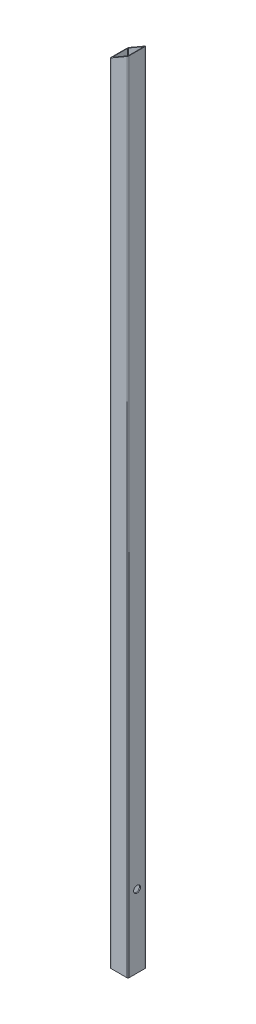
ISO-10303-21;
HEADER;
FILE_DESCRIPTION(('STEP AP214'),'2;1');
FILE_NAME('part.step','',(''),(''),'','','');
FILE_SCHEMA(('AUTOMOTIVE_DESIGN { 1 0 10303 214 1 1 1 1 }'));
ENDSEC;
DATA;
#1=APPLICATION_CONTEXT('core data for automotive mechanical design processes');
#2=APPLICATION_PROTOCOL_DEFINITION('international standard','automotive_design',2000,#1);
#3=PRODUCT_CONTEXT('',#1,'mechanical');
#4=PRODUCT('Part','Part','',(#3));
#5=PRODUCT_RELATED_PRODUCT_CATEGORY('part','',(#4));
#6=PRODUCT_DEFINITION_FORMATION('','',#4);
#7=PRODUCT_DEFINITION_CONTEXT('part definition',#1,'design');
#8=PRODUCT_DEFINITION('design','',#6,#7);
#9=PRODUCT_DEFINITION_SHAPE('','',#8);
#10=(LENGTH_UNIT() NAMED_UNIT(*) SI_UNIT(.MILLI.,.METRE.));
#11=(NAMED_UNIT(*) PLANE_ANGLE_UNIT() SI_UNIT($,.RADIAN.));
#12=(NAMED_UNIT(*) SI_UNIT($,.STERADIAN.) SOLID_ANGLE_UNIT());
#13=UNCERTAINTY_MEASURE_WITH_UNIT(LENGTH_MEASURE(1.E-05),#10,'distance_accuracy_value','');
#14=(GEOMETRIC_REPRESENTATION_CONTEXT(3) GLOBAL_UNCERTAINTY_ASSIGNED_CONTEXT((#13)) GLOBAL_UNIT_ASSIGNED_CONTEXT((#10,
#11,#12)) REPRESENTATION_CONTEXT('',''));
#15=CARTESIAN_POINT('',(0.,0.,0.));
#16=DIRECTION('',(0.,0.,1.));
#17=DIRECTION('',(1.,0.,0.));
#18=AXIS2_PLACEMENT_3D('',#15,#16,#17);
#19=CARTESIAN_POINT('',(-22.,-150.,22.));
#20=DIRECTION('',(0.,1.,0.));
#21=DIRECTION('',(0.,0.,1.));
#22=AXIS2_PLACEMENT_3D('',#19,#20,#21);
#23=CYLINDRICAL_SURFACE('',#22,3.);
#24=DIRECTION('',(0.,1.,0.));
#25=VECTOR('',#24,1.);
#26=CARTESIAN_POINT('',(-22.,-150.,25.));
#27=LINE('',#26,#25);
#28=CARTESIAN_POINT('',(-22.,-150.,25.));
#29=VERTEX_POINT('',#28);
#30=CARTESIAN_POINT('',(-22.,2019.97778600214,25.));
#31=VERTEX_POINT('',#30);
#32=EDGE_CURVE('E159',#29,#31,#27,.T.);
#33=ORIENTED_EDGE('',*,*,#32,.T.);
#34=CARTESIAN_POINT('',(-22.,2019.97778600214,22.));
#35=DIRECTION('',(0.5,-0.866025403784439,0.));
#36=DIRECTION('',(-0.866025403784439,-0.5,0.));
#37=AXIS2_PLACEMENT_3D('',#34,#35,#36);
#38=ELLIPSE('',#37,3.46410161513776,3.);
#39=CARTESIAN_POINT('',(-25.,2018.24573519457,22.));
#40=VERTEX_POINT('',#39);
#41=EDGE_CURVE('E169',#31,#40,#38,.T.);
#42=ORIENTED_EDGE('',*,*,#41,.T.);
#43=DIRECTION('',(0.,1.,0.));
#44=VECTOR('',#43,1.);
#45=CARTESIAN_POINT('',(-25.,-150.,22.));
#46=LINE('',#45,#44);
#47=CARTESIAN_POINT('',(-25.,-150.,22.));
#48=VERTEX_POINT('',#47);
#49=EDGE_CURVE('E11',#48,#40,#46,.T.);
#50=ORIENTED_EDGE('',*,*,#49,.F.);
#51=CARTESIAN_POINT('',(-22.,-150.,22.));
#52=DIRECTION('',(0.,1.,0.));
#53=DIRECTION('',(0.,0.,1.));
#54=AXIS2_PLACEMENT_3D('',#51,#52,#53);
#55=CIRCLE('',#54,3.);
#56=EDGE_CURVE('E236',#48,#29,#55,.T.);
#57=ORIENTED_EDGE('',*,*,#56,.T.);
#58=EDGE_LOOP('',(#33,#42,#50,#57));
#59=FACE_BOUND('',#58,.T.);
#60=ADVANCED_FACE('F35',(#59),#23,.T.);
#61=CARTESIAN_POINT('',(-25.,-150.,-22.));
#62=DIRECTION('',(-1.,0.,0.));
#63=DIRECTION('',(0.,0.,1.));
#64=AXIS2_PLACEMENT_3D('',#61,#62,#63);
#65=PLANE('',#64);
#66=CARTESIAN_POINT('',(-25.,50.,-2.1163626406917E-13));
#67=DIRECTION('',(-1.,0.,0.));
#68=DIRECTION('',(0.,0.,1.));
#69=AXIS2_PLACEMENT_3D('',#66,#67,#68);
#70=CIRCLE('',#69,9.5);
#71=CARTESIAN_POINT('',(-25.,50.,9.49999999999979));
#72=VERTEX_POINT('',#71);
#73=EDGE_CURVE('E367',#72,#72,#70,.T.);
#74=ORIENTED_EDGE('',*,*,#73,.F.);
#75=EDGE_LOOP('',(#74));
#76=FACE_BOUND('',#75,.T.);
#77=ORIENTED_EDGE('',*,*,#49,.T.);
#78=DIRECTION('',(0.,0.,-1.));
#79=VECTOR('',#78,1.);
#80=CARTESIAN_POINT('',(-25.,2018.24573519457,-22.));
#81=LINE('',#80,#79);
#82=CARTESIAN_POINT('',(-25.,2018.24573519457,-22.));
#83=VERTEX_POINT('',#82);
#84=EDGE_CURVE('E186',#40,#83,#81,.T.);
#85=ORIENTED_EDGE('',*,*,#84,.T.);
#86=DIRECTION('',(0.,1.,0.));
#87=VECTOR('',#86,1.);
#88=CARTESIAN_POINT('',(-25.,-150.,-22.));
#89=LINE('',#88,#87);
#90=CARTESIAN_POINT('',(-25.,-150.,-22.));
#91=VERTEX_POINT('',#90);
#92=EDGE_CURVE('E43',#91,#83,#89,.T.);
#93=ORIENTED_EDGE('',*,*,#92,.F.);
#94=DIRECTION('',(0.,0.,1.));
#95=VECTOR('',#94,1.);
#96=CARTESIAN_POINT('',(-25.,-150.,-22.));
#97=LINE('',#96,#95);
#98=EDGE_CURVE('E266',#91,#48,#97,.T.);
#99=ORIENTED_EDGE('',*,*,#98,.T.);
#100=EDGE_LOOP('',(#77,#85,#93,#99));
#101=FACE_BOUND('',#100,.T.);
#102=ADVANCED_FACE('F295',(#76,#101),#65,.T.);
#103=CARTESIAN_POINT('',(-22.,-150.,-22.));
#104=DIRECTION('',(0.,1.,0.));
#105=DIRECTION('',(0.,0.,1.));
#106=AXIS2_PLACEMENT_3D('',#103,#104,#105);
#107=CYLINDRICAL_SURFACE('',#106,3.);
#108=ORIENTED_EDGE('',*,*,#92,.T.);
#109=CARTESIAN_POINT('',(-22.,2019.97778600214,-22.));
#110=DIRECTION('',(0.5,-0.866025403784439,0.));
#111=DIRECTION('',(-0.866025403784439,-0.5,0.));
#112=AXIS2_PLACEMENT_3D('',#109,#110,#111);
#113=ELLIPSE('',#112,3.46410161513776,3.);
#114=CARTESIAN_POINT('',(-22.,2019.97778600214,-25.));
#115=VERTEX_POINT('',#114);
#116=EDGE_CURVE('E183',#83,#115,#113,.T.);
#117=ORIENTED_EDGE('',*,*,#116,.T.);
#118=DIRECTION('',(0.,1.,0.));
#119=VECTOR('',#118,1.);
#120=CARTESIAN_POINT('',(-22.,-150.,-25.));
#121=LINE('',#120,#119);
#122=CARTESIAN_POINT('',(-22.,-150.,-25.));
#123=VERTEX_POINT('',#122);
#124=EDGE_CURVE('E270',#123,#115,#121,.T.);
#125=ORIENTED_EDGE('',*,*,#124,.F.);
#126=CARTESIAN_POINT('',(-22.,-150.,-22.));
#127=DIRECTION('',(0.,1.,0.));
#128=DIRECTION('',(0.,0.,1.));
#129=AXIS2_PLACEMENT_3D('',#126,#127,#128);
#130=CIRCLE('',#129,3.);
#131=EDGE_CURVE('E263',#123,#91,#130,.T.);
#132=ORIENTED_EDGE('',*,*,#131,.T.);
#133=EDGE_LOOP('',(#108,#117,#125,#132));
#134=FACE_BOUND('',#133,.T.);
#135=ADVANCED_FACE('F292',(#134),#107,.T.);
#136=CARTESIAN_POINT('',(-22.,-150.,-25.));
#137=DIRECTION('',(0.,0.,-1.));
#138=DIRECTION('',(-1.,0.,0.));
#139=AXIS2_PLACEMENT_3D('',#136,#137,#138);
#140=PLANE('',#139);
#141=ORIENTED_EDGE('',*,*,#124,.T.);
#142=DIRECTION('',(0.866025403784439,0.5,0.));
#143=VECTOR('',#142,1.);
#144=CARTESIAN_POINT('',(16.4869804220584,2042.19825450911,-25.));
#145=LINE('',#144,#143);
#146=CARTESIAN_POINT('',(22.,2045.38119784648,-25.));
#147=VERTEX_POINT('',#146);
#148=EDGE_CURVE('E180',#115,#147,#145,.T.);
#149=ORIENTED_EDGE('',*,*,#148,.T.);
#150=DIRECTION('',(0.,1.,0.));
#151=VECTOR('',#150,1.);
#152=CARTESIAN_POINT('',(22.,-150.,-25.));
#153=LINE('',#152,#151);
#154=CARTESIAN_POINT('',(22.,-150.,-25.));
#155=VERTEX_POINT('',#154);
#156=EDGE_CURVE('E272',#155,#147,#153,.T.);
#157=ORIENTED_EDGE('',*,*,#156,.F.);
#158=DIRECTION('',(-1.,0.,0.));
#159=VECTOR('',#158,1.);
#160=CARTESIAN_POINT('',(-22.,-150.,-25.));
#161=LINE('',#160,#159);
#162=EDGE_CURVE('E260',#155,#123,#161,.T.);
#163=ORIENTED_EDGE('',*,*,#162,.T.);
#164=EDGE_LOOP('',(#141,#149,#157,#163));
#165=FACE_BOUND('',#164,.T.);
#166=ADVANCED_FACE('F289',(#165),#140,.T.);
#167=CARTESIAN_POINT('',(22.,-150.,-22.));
#168=DIRECTION('',(0.,1.,0.));
#169=DIRECTION('',(0.,0.,1.));
#170=AXIS2_PLACEMENT_3D('',#167,#168,#169);
#171=CYLINDRICAL_SURFACE('',#170,3.00000000000001);
#172=ORIENTED_EDGE('',*,*,#156,.T.);
#173=CARTESIAN_POINT('',(22.,2045.38119784648,-22.));
#174=DIRECTION('',(0.5,-0.866025403784439,0.));
#175=DIRECTION('',(-0.866025403784439,-0.5,0.));
#176=AXIS2_PLACEMENT_3D('',#173,#174,#175);
#177=ELLIPSE('',#176,3.46410161513776,3.00000000000001);
#178=CARTESIAN_POINT('',(25.,2047.11324865405,-22.));
#179=VERTEX_POINT('',#178);
#180=EDGE_CURVE('E174',#147,#179,#177,.T.);
#181=ORIENTED_EDGE('',*,*,#180,.T.);
#182=DIRECTION('',(0.,1.,0.));
#183=VECTOR('',#182,1.);
#184=CARTESIAN_POINT('',(25.,-150.,-22.));
#185=LINE('',#184,#183);
#186=CARTESIAN_POINT('',(25.,-150.,-22.));
#187=VERTEX_POINT('',#186);
#188=EDGE_CURVE('E274',#187,#179,#185,.T.);
#189=ORIENTED_EDGE('',*,*,#188,.F.);
#190=CARTESIAN_POINT('',(22.,-150.,-22.));
#191=DIRECTION('',(0.,1.,0.));
#192=DIRECTION('',(0.,0.,-1.));
#193=AXIS2_PLACEMENT_3D('',#190,#191,#192);
#194=CIRCLE('',#193,3.00000000000001);
#195=EDGE_CURVE('E257',#187,#155,#194,.T.);
#196=ORIENTED_EDGE('',*,*,#195,.T.);
#197=EDGE_LOOP('',(#172,#181,#189,#196));
#198=FACE_BOUND('',#197,.T.);
#199=ADVANCED_FACE('F287',(#198),#171,.T.);
#200=CARTESIAN_POINT('',(25.,-150.,-22.));
#201=DIRECTION('',(1.,0.,0.));
#202=DIRECTION('',(0.,0.,-1.));
#203=AXIS2_PLACEMENT_3D('',#200,#201,#202);
#204=PLANE('',#203);
#205=CARTESIAN_POINT('',(25.,50.,-2.1163626406917E-13));
#206=DIRECTION('',(-1.,0.,0.));
#207=DIRECTION('',(0.,0.,1.));
#208=AXIS2_PLACEMENT_3D('',#205,#206,#207);
#209=CIRCLE('',#208,9.5);
#210=CARTESIAN_POINT('',(25.,50.,9.49999999999979));
#211=VERTEX_POINT('',#210);
#212=EDGE_CURVE('E363',#211,#211,#209,.T.);
#213=ORIENTED_EDGE('',*,*,#212,.T.);
#214=EDGE_LOOP('',(#213));
#215=FACE_BOUND('',#214,.T.);
#216=ORIENTED_EDGE('',*,*,#188,.T.);
#217=DIRECTION('',(0.,0.,1.));
#218=VECTOR('',#217,1.);
#219=CARTESIAN_POINT('',(25.,2047.11324865405,-22.));
#220=LINE('',#219,#218);
#221=CARTESIAN_POINT('',(25.,2047.11324865405,22.));
#222=VERTEX_POINT('',#221);
#223=EDGE_CURVE('E172',#179,#222,#220,.T.);
#224=ORIENTED_EDGE('',*,*,#223,.T.);
#225=DIRECTION('',(0.,1.,0.));
#226=VECTOR('',#225,1.);
#227=CARTESIAN_POINT('',(25.,-150.,22.));
#228=LINE('',#227,#226);
#229=CARTESIAN_POINT('',(25.,-150.,22.));
#230=VERTEX_POINT('',#229);
#231=EDGE_CURVE('E158',#230,#222,#228,.T.);
#232=ORIENTED_EDGE('',*,*,#231,.F.);
#233=DIRECTION('',(0.,0.,-1.));
#234=VECTOR('',#233,1.);
#235=CARTESIAN_POINT('',(25.,-150.,-22.));
#236=LINE('',#235,#234);
#237=EDGE_CURVE('E254',#230,#187,#236,.T.);
#238=ORIENTED_EDGE('',*,*,#237,.T.);
#239=EDGE_LOOP('',(#216,#224,#232,#238));
#240=FACE_BOUND('',#239,.T.);
#241=ADVANCED_FACE('F283',(#215,#240),#204,.T.);
#242=CARTESIAN_POINT('',(22.,-150.,22.));
#243=DIRECTION('',(0.,1.,0.));
#244=DIRECTION('',(0.,0.,1.));
#245=AXIS2_PLACEMENT_3D('',#242,#243,#244);
#246=CYLINDRICAL_SURFACE('',#245,3.);
#247=ORIENTED_EDGE('',*,*,#231,.T.);
#248=CARTESIAN_POINT('',(22.,2045.38119784648,22.));
#249=DIRECTION('',(0.5,-0.866025403784439,0.));
#250=DIRECTION('',(-0.866025403784439,-0.5,0.));
#251=AXIS2_PLACEMENT_3D('',#248,#249,#250);
#252=ELLIPSE('',#251,3.46410161513775,3.);
#253=CARTESIAN_POINT('',(22.,2045.38119784648,25.));
#254=VERTEX_POINT('',#253);
#255=EDGE_CURVE('E166',#222,#254,#252,.T.);
#256=ORIENTED_EDGE('',*,*,#255,.T.);
#257=DIRECTION('',(0.,1.,0.));
#258=VECTOR('',#257,1.);
#259=CARTESIAN_POINT('',(22.,-150.,25.));
#260=LINE('',#259,#258);
#261=CARTESIAN_POINT('',(22.,-150.,25.));
#262=VERTEX_POINT('',#261);
#263=EDGE_CURVE('E148',#262,#254,#260,.T.);
#264=ORIENTED_EDGE('',*,*,#263,.F.);
#265=CARTESIAN_POINT('',(22.,-150.,22.));
#266=DIRECTION('',(0.,1.,0.));
#267=DIRECTION('',(0.,0.,1.));
#268=AXIS2_PLACEMENT_3D('',#265,#266,#267);
#269=CIRCLE('',#268,3.);
#270=EDGE_CURVE('E252',#262,#230,#269,.T.);
#271=ORIENTED_EDGE('',*,*,#270,.T.);
#272=EDGE_LOOP('',(#247,#256,#264,#271));
#273=FACE_BOUND('',#272,.T.);
#274=ADVANCED_FACE('F171',(#273),#246,.T.);
#275=CARTESIAN_POINT('',(-22.,-150.,25.));
#276=DIRECTION('',(0.,0.,1.));
#277=DIRECTION('',(1.,0.,0.));
#278=AXIS2_PLACEMENT_3D('',#275,#276,#277);
#279=PLANE('',#278);
#280=ORIENTED_EDGE('',*,*,#263,.T.);
#281=DIRECTION('',(-0.866025403784439,-0.5,0.));
#282=VECTOR('',#281,1.);
#283=CARTESIAN_POINT('',(16.4869804220584,2042.19825450911,25.));
#284=LINE('',#283,#282);
#285=EDGE_CURVE('E151',#254,#31,#284,.T.);
#286=ORIENTED_EDGE('',*,*,#285,.T.);
#287=ORIENTED_EDGE('',*,*,#32,.F.);
#288=DIRECTION('',(1.,0.,0.));
#289=VECTOR('',#288,1.);
#290=CARTESIAN_POINT('',(-22.,-150.,25.));
#291=LINE('',#290,#289);
#292=EDGE_CURVE('E153',#29,#262,#291,.T.);
#293=ORIENTED_EDGE('',*,*,#292,.T.);
#294=EDGE_LOOP('',(#280,#286,#287,#293));
#295=FACE_BOUND('',#294,.T.);
#296=ADVANCED_FACE('F150',(#295),#279,.T.);
#297=CARTESIAN_POINT('',(-22.,-150.,22.));
#298=DIRECTION('',(0.,1.,0.));
#299=DIRECTION('',(0.,0.,1.));
#300=AXIS2_PLACEMENT_3D('',#297,#298,#299);
#301=PLANE('',#300);
#302=DIRECTION('',(0.,0.,1.));
#303=VECTOR('',#302,1.);
#304=CARTESIAN_POINT('',(-22.,-150.,-20.));
#305=LINE('',#304,#303);
#306=CARTESIAN_POINT('',(-22.,-150.,-20.));
#307=VERTEX_POINT('',#306);
#308=CARTESIAN_POINT('',(-22.,-150.,20.));
#309=VERTEX_POINT('',#308);
#310=EDGE_CURVE('E230',#307,#309,#305,.T.);
#311=ORIENTED_EDGE('',*,*,#310,.T.);
#312=CARTESIAN_POINT('',(-20.,-150.,20.));
#313=DIRECTION('',(0.,1.,0.));
#314=DIRECTION('',(0.,0.,1.));
#315=AXIS2_PLACEMENT_3D('',#312,#313,#314);
#316=CIRCLE('',#315,2.);
#317=CARTESIAN_POINT('',(-20.,-150.,22.));
#318=VERTEX_POINT('',#317);
#319=EDGE_CURVE('E196',#309,#318,#316,.T.);
#320=ORIENTED_EDGE('',*,*,#319,.T.);
#321=DIRECTION('',(1.,0.,0.));
#322=VECTOR('',#321,1.);
#323=CARTESIAN_POINT('',(-20.,-150.,22.));
#324=LINE('',#323,#322);
#325=CARTESIAN_POINT('',(20.,-150.,22.));
#326=VERTEX_POINT('',#325);
#327=EDGE_CURVE('E214',#318,#326,#324,.T.);
#328=ORIENTED_EDGE('',*,*,#327,.T.);
#329=CARTESIAN_POINT('',(20.,-150.,20.));
#330=DIRECTION('',(0.,1.,0.));
#331=DIRECTION('',(0.,0.,1.));
#332=AXIS2_PLACEMENT_3D('',#329,#330,#331);
#333=CIRCLE('',#332,2.);
#334=CARTESIAN_POINT('',(22.,-150.,20.));
#335=VERTEX_POINT('',#334);
#336=EDGE_CURVE('E51',#326,#335,#333,.T.);
#337=ORIENTED_EDGE('',*,*,#336,.T.);
#338=DIRECTION('',(0.,0.,-1.));
#339=VECTOR('',#338,1.);
#340=CARTESIAN_POINT('',(22.,-150.,-20.));
#341=LINE('',#340,#339);
#342=CARTESIAN_POINT('',(22.,-150.,-20.));
#343=VERTEX_POINT('',#342);
#344=EDGE_CURVE('E218',#335,#343,#341,.T.);
#345=ORIENTED_EDGE('',*,*,#344,.T.);
#346=CARTESIAN_POINT('',(20.,-150.,-20.));
#347=DIRECTION('',(0.,1.,0.));
#348=DIRECTION('',(0.,0.,-1.));
#349=AXIS2_PLACEMENT_3D('',#346,#347,#348);
#350=CIRCLE('',#349,2.);
#351=CARTESIAN_POINT('',(20.,-150.,-22.));
#352=VERTEX_POINT('',#351);
#353=EDGE_CURVE('E221',#343,#352,#350,.T.);
#354=ORIENTED_EDGE('',*,*,#353,.T.);
#355=DIRECTION('',(-1.,0.,0.));
#356=VECTOR('',#355,1.);
#357=CARTESIAN_POINT('',(-20.,-150.,-22.));
#358=LINE('',#357,#356);
#359=CARTESIAN_POINT('',(-20.,-150.,-22.));
#360=VERTEX_POINT('',#359);
#361=EDGE_CURVE('E224',#352,#360,#358,.T.);
#362=ORIENTED_EDGE('',*,*,#361,.T.);
#363=CARTESIAN_POINT('',(-20.,-150.,-20.));
#364=DIRECTION('',(0.,1.,0.));
#365=DIRECTION('',(0.,0.,1.));
#366=AXIS2_PLACEMENT_3D('',#363,#364,#365);
#367=CIRCLE('',#366,2.);
#368=EDGE_CURVE('E227',#360,#307,#367,.T.);
#369=ORIENTED_EDGE('',*,*,#368,.T.);
#370=EDGE_LOOP('',(#311,#320,#328,#337,#345,#354,#362,#369));
#371=FACE_BOUND('',#370,.T.);
#372=ORIENTED_EDGE('',*,*,#56,.F.);
#373=ORIENTED_EDGE('',*,*,#98,.F.);
#374=ORIENTED_EDGE('',*,*,#131,.F.);
#375=ORIENTED_EDGE('',*,*,#162,.F.);
#376=ORIENTED_EDGE('',*,*,#195,.F.);
#377=ORIENTED_EDGE('',*,*,#237,.F.);
#378=ORIENTED_EDGE('',*,*,#270,.F.);
#379=ORIENTED_EDGE('',*,*,#292,.F.);
#380=EDGE_LOOP('',(#372,#373,#374,#375,#376,#377,#378,#379));
#381=FACE_BOUND('',#380,.T.);
#382=ADVANCED_FACE('F277',(#371,#381),#301,.F.);
#383=CARTESIAN_POINT('',(-20.,-150.,20.));
#384=DIRECTION('',(0.,1.,0.));
#385=DIRECTION('',(0.,0.,1.));
#386=AXIS2_PLACEMENT_3D('',#383,#384,#385);
#387=CYLINDRICAL_SURFACE('',#386,2.);
#388=DIRECTION('',(0.,1.,0.));
#389=VECTOR('',#388,1.);
#390=CARTESIAN_POINT('',(-22.,-150.,20.));
#391=LINE('',#390,#389);
#392=CARTESIAN_POINT('',(-22.,2019.97778600214,20.));
#393=VERTEX_POINT('',#392);
#394=EDGE_CURVE('E234',#309,#393,#391,.T.);
#395=ORIENTED_EDGE('',*,*,#394,.T.);
#396=CARTESIAN_POINT('',(-20.,2021.13248654052,20.));
#397=DIRECTION('',(0.5,-0.866025403784439,0.));
#398=DIRECTION('',(-0.866025403784439,-0.5,0.));
#399=AXIS2_PLACEMENT_3D('',#396,#397,#398);
#400=ELLIPSE('',#399,2.30940107675851,2.);
#401=CARTESIAN_POINT('',(-20.,2021.13248654052,22.));
#402=VERTEX_POINT('',#401);
#403=EDGE_CURVE('E189',#402,#393,#400,.T.);
#404=ORIENTED_EDGE('',*,*,#403,.F.);
#405=DIRECTION('',(0.,1.,0.));
#406=VECTOR('',#405,1.);
#407=CARTESIAN_POINT('',(-20.,-150.,22.));
#408=LINE('',#407,#406);
#409=EDGE_CURVE('E233',#318,#402,#408,.T.);
#410=ORIENTED_EDGE('',*,*,#409,.F.);
#411=ORIENTED_EDGE('',*,*,#319,.F.);
#412=EDGE_LOOP('',(#395,#404,#410,#411));
#413=FACE_BOUND('',#412,.T.);
#414=ADVANCED_FACE('F321',(#413),#387,.F.);
#415=CARTESIAN_POINT('',(-22.,-150.,-20.));
#416=DIRECTION('',(-1.,0.,0.));
#417=DIRECTION('',(0.,0.,1.));
#418=AXIS2_PLACEMENT_3D('',#415,#416,#417);
#419=PLANE('',#418);
#420=CARTESIAN_POINT('',(-22.,50.,-2.1163626406917E-13));
#421=DIRECTION('',(-1.,0.,0.));
#422=DIRECTION('',(0.,0.,1.));
#423=AXIS2_PLACEMENT_3D('',#420,#421,#422);
#424=CIRCLE('',#423,9.5);
#425=CARTESIAN_POINT('',(-22.,50.,9.49999999999979));
#426=VERTEX_POINT('',#425);
#427=EDGE_CURVE('E357',#426,#426,#424,.T.);
#428=ORIENTED_EDGE('',*,*,#427,.T.);
#429=EDGE_LOOP('',(#428));
#430=FACE_BOUND('',#429,.T.);
#431=DIRECTION('',(0.,1.,0.));
#432=VECTOR('',#431,1.);
#433=CARTESIAN_POINT('',(-22.,-150.,-20.));
#434=LINE('',#433,#432);
#435=CARTESIAN_POINT('',(-22.,2019.97778600214,-20.));
#436=VERTEX_POINT('',#435);
#437=EDGE_CURVE('E237',#307,#436,#434,.T.);
#438=ORIENTED_EDGE('',*,*,#437,.T.);
#439=DIRECTION('',(0.,0.,-1.));
#440=VECTOR('',#439,1.);
#441=CARTESIAN_POINT('',(-22.,2019.97778600214,-20.));
#442=LINE('',#441,#440);
#443=EDGE_CURVE('E192',#393,#436,#442,.T.);
#444=ORIENTED_EDGE('',*,*,#443,.F.);
#445=ORIENTED_EDGE('',*,*,#394,.F.);
#446=ORIENTED_EDGE('',*,*,#310,.F.);
#447=EDGE_LOOP('',(#438,#444,#445,#446));
#448=FACE_BOUND('',#447,.T.);
#449=ADVANCED_FACE('F326',(#430,#448),#419,.F.);
#450=CARTESIAN_POINT('',(-20.,-150.,-20.));
#451=DIRECTION('',(0.,1.,0.));
#452=DIRECTION('',(0.,0.,1.));
#453=AXIS2_PLACEMENT_3D('',#450,#451,#452);
#454=CYLINDRICAL_SURFACE('',#453,2.);
#455=DIRECTION('',(0.,1.,0.));
#456=VECTOR('',#455,1.);
#457=CARTESIAN_POINT('',(-20.,-150.,-22.));
#458=LINE('',#457,#456);
#459=CARTESIAN_POINT('',(-20.,2021.13248654052,-22.));
#460=VERTEX_POINT('',#459);
#461=EDGE_CURVE('E239',#360,#460,#458,.T.);
#462=ORIENTED_EDGE('',*,*,#461,.T.);
#463=CARTESIAN_POINT('',(-20.,2021.13248654052,-20.));
#464=DIRECTION('',(0.5,-0.866025403784439,0.));
#465=DIRECTION('',(-0.866025403784439,-0.5,0.));
#466=AXIS2_PLACEMENT_3D('',#463,#464,#465);
#467=ELLIPSE('',#466,2.30940107675851,2.);
#468=EDGE_CURVE('E209',#436,#460,#467,.T.);
#469=ORIENTED_EDGE('',*,*,#468,.F.);
#470=ORIENTED_EDGE('',*,*,#437,.F.);
#471=ORIENTED_EDGE('',*,*,#368,.F.);
#472=EDGE_LOOP('',(#462,#469,#470,#471));
#473=FACE_BOUND('',#472,.T.);
#474=ADVANCED_FACE('F353',(#473),#454,.F.);
#475=CARTESIAN_POINT('',(-20.,-150.,-22.));
#476=DIRECTION('',(0.,0.,-1.));
#477=DIRECTION('',(-1.,0.,0.));
#478=AXIS2_PLACEMENT_3D('',#475,#476,#477);
#479=PLANE('',#478);
#480=DIRECTION('',(0.,1.,0.));
#481=VECTOR('',#480,1.);
#482=CARTESIAN_POINT('',(20.,-150.,-22.));
#483=LINE('',#482,#481);
#484=CARTESIAN_POINT('',(20.,2044.2264973081,-22.));
#485=VERTEX_POINT('',#484);
#486=EDGE_CURVE('E241',#352,#485,#483,.T.);
#487=ORIENTED_EDGE('',*,*,#486,.T.);
#488=DIRECTION('',(0.866025403784439,0.5,0.));
#489=VECTOR('',#488,1.);
#490=CARTESIAN_POINT('',(17.9869804220584,2043.06427991289,-22.));
#491=LINE('',#490,#489);
#492=EDGE_CURVE('E206',#460,#485,#491,.T.);
#493=ORIENTED_EDGE('',*,*,#492,.F.);
#494=ORIENTED_EDGE('',*,*,#461,.F.);
#495=ORIENTED_EDGE('',*,*,#361,.F.);
#496=EDGE_LOOP('',(#487,#493,#494,#495));
#497=FACE_BOUND('',#496,.T.);
#498=ADVANCED_FACE('F350',(#497),#479,.F.);
#499=CARTESIAN_POINT('',(20.,-150.,-20.));
#500=DIRECTION('',(0.,1.,0.));
#501=DIRECTION('',(0.,0.,1.));
#502=AXIS2_PLACEMENT_3D('',#499,#500,#501);
#503=CYLINDRICAL_SURFACE('',#502,2.);
#504=DIRECTION('',(0.,1.,0.));
#505=VECTOR('',#504,1.);
#506=CARTESIAN_POINT('',(22.,-150.,-20.));
#507=LINE('',#506,#505);
#508=CARTESIAN_POINT('',(22.,2045.38119784648,-20.));
#509=VERTEX_POINT('',#508);
#510=EDGE_CURVE('E243',#343,#509,#507,.T.);
#511=ORIENTED_EDGE('',*,*,#510,.T.);
#512=CARTESIAN_POINT('',(20.,2044.2264973081,-20.));
#513=DIRECTION('',(0.5,-0.866025403784439,0.));
#514=DIRECTION('',(-0.866025403784439,-0.5,0.));
#515=AXIS2_PLACEMENT_3D('',#512,#513,#514);
#516=ELLIPSE('',#515,2.30940107675851,2.);
#517=EDGE_CURVE('E203',#485,#509,#516,.T.);
#518=ORIENTED_EDGE('',*,*,#517,.F.);
#519=ORIENTED_EDGE('',*,*,#486,.F.);
#520=ORIENTED_EDGE('',*,*,#353,.F.);
#521=EDGE_LOOP('',(#511,#518,#519,#520));
#522=FACE_BOUND('',#521,.T.);
#523=ADVANCED_FACE('F346',(#522),#503,.F.);
#524=CARTESIAN_POINT('',(22.,-150.,-20.));
#525=DIRECTION('',(1.,0.,0.));
#526=DIRECTION('',(0.,0.,-1.));
#527=AXIS2_PLACEMENT_3D('',#524,#525,#526);
#528=PLANE('',#527);
#529=CARTESIAN_POINT('',(22.,50.,-2.1163626406917E-13));
#530=DIRECTION('',(1.,0.,0.));
#531=DIRECTION('',(0.,0.,-1.));
#532=AXIS2_PLACEMENT_3D('',#529,#530,#531);
#533=CIRCLE('',#532,9.5);
#534=CARTESIAN_POINT('',(22.,50.,-9.50000000000021));
#535=VERTEX_POINT('',#534);
#536=EDGE_CURVE('E38',#535,#535,#533,.T.);
#537=ORIENTED_EDGE('',*,*,#536,.T.);
#538=EDGE_LOOP('',(#537));
#539=FACE_BOUND('',#538,.T.);
#540=DIRECTION('',(0.,1.,0.));
#541=VECTOR('',#540,1.);
#542=CARTESIAN_POINT('',(22.,-150.,20.));
#543=LINE('',#542,#541);
#544=CARTESIAN_POINT('',(22.,2045.38119784648,20.));
#545=VERTEX_POINT('',#544);
#546=EDGE_CURVE('E245',#335,#545,#543,.T.);
#547=ORIENTED_EDGE('',*,*,#546,.T.);
#548=DIRECTION('',(0.,0.,1.));
#549=VECTOR('',#548,1.);
#550=CARTESIAN_POINT('',(22.,2045.38119784648,-20.));
#551=LINE('',#550,#549);
#552=EDGE_CURVE('E200',#509,#545,#551,.T.);
#553=ORIENTED_EDGE('',*,*,#552,.F.);
#554=ORIENTED_EDGE('',*,*,#510,.F.);
#555=ORIENTED_EDGE('',*,*,#344,.F.);
#556=EDGE_LOOP('',(#547,#553,#554,#555));
#557=FACE_BOUND('',#556,.T.);
#558=ADVANCED_FACE('F342',(#539,#557),#528,.F.);
#559=CARTESIAN_POINT('',(20.,-150.,20.));
#560=DIRECTION('',(0.,1.,0.));
#561=DIRECTION('',(0.,0.,1.));
#562=AXIS2_PLACEMENT_3D('',#559,#560,#561);
#563=CYLINDRICAL_SURFACE('',#562,2.);
#564=DIRECTION('',(0.,1.,0.));
#565=VECTOR('',#564,1.);
#566=CARTESIAN_POINT('',(20.,-150.,22.));
#567=LINE('',#566,#565);
#568=CARTESIAN_POINT('',(20.,2044.2264973081,22.));
#569=VERTEX_POINT('',#568);
#570=EDGE_CURVE('E247',#326,#569,#567,.T.);
#571=ORIENTED_EDGE('',*,*,#570,.T.);
#572=CARTESIAN_POINT('',(20.,2044.2264973081,20.));
#573=DIRECTION('',(0.5,-0.866025403784439,0.));
#574=DIRECTION('',(-0.866025403784439,-0.5,0.));
#575=AXIS2_PLACEMENT_3D('',#572,#573,#574);
#576=ELLIPSE('',#575,2.30940107675851,2.);
#577=EDGE_CURVE('E197',#545,#569,#576,.T.);
#578=ORIENTED_EDGE('',*,*,#577,.F.);
#579=ORIENTED_EDGE('',*,*,#546,.F.);
#580=ORIENTED_EDGE('',*,*,#336,.F.);
#581=EDGE_LOOP('',(#571,#578,#579,#580));
#582=FACE_BOUND('',#581,.T.);
#583=ADVANCED_FACE('F394',(#582),#563,.F.);
#584=CARTESIAN_POINT('',(-20.,-150.,22.));
#585=DIRECTION('',(0.,0.,1.));
#586=DIRECTION('',(1.,0.,0.));
#587=AXIS2_PLACEMENT_3D('',#584,#585,#586);
#588=PLANE('',#587);
#589=ORIENTED_EDGE('',*,*,#409,.T.);
#590=DIRECTION('',(-0.866025403784439,-0.5,0.));
#591=VECTOR('',#590,1.);
#592=CARTESIAN_POINT('',(17.9869804220584,2043.06427991289,22.));
#593=LINE('',#592,#591);
#594=EDGE_CURVE('E193',#569,#402,#593,.T.);
#595=ORIENTED_EDGE('',*,*,#594,.F.);
#596=ORIENTED_EDGE('',*,*,#570,.F.);
#597=ORIENTED_EDGE('',*,*,#327,.F.);
#598=EDGE_LOOP('',(#589,#595,#596,#597));
#599=FACE_BOUND('',#598,.T.);
#600=ADVANCED_FACE('F338',(#599),#588,.F.);
#601=CARTESIAN_POINT('',(1672.50000000001,2998.29781714396,22.0000000000005));
#602=DIRECTION('',(0.5,-0.866025403784439,0.));
#603=DIRECTION('',(0.,0.,1.));
#604=AXIS2_PLACEMENT_3D('',#601,#602,#603);
#605=PLANE('',#604);
#606=ORIENTED_EDGE('',*,*,#403,.T.);
#607=ORIENTED_EDGE('',*,*,#443,.T.);
#608=ORIENTED_EDGE('',*,*,#468,.T.);
#609=ORIENTED_EDGE('',*,*,#492,.T.);
#610=ORIENTED_EDGE('',*,*,#517,.T.);
#611=ORIENTED_EDGE('',*,*,#552,.T.);
#612=ORIENTED_EDGE('',*,*,#577,.T.);
#613=ORIENTED_EDGE('',*,*,#594,.T.);
#614=EDGE_LOOP('',(#606,#607,#608,#609,#610,#611,#612,#613));
#615=FACE_BOUND('',#614,.T.);
#616=ORIENTED_EDGE('',*,*,#285,.F.);
#617=ORIENTED_EDGE('',*,*,#255,.F.);
#618=ORIENTED_EDGE('',*,*,#223,.F.);
#619=ORIENTED_EDGE('',*,*,#180,.F.);
#620=ORIENTED_EDGE('',*,*,#148,.F.);
#621=ORIENTED_EDGE('',*,*,#116,.F.);
#622=ORIENTED_EDGE('',*,*,#84,.F.);
#623=ORIENTED_EDGE('',*,*,#41,.F.);
#624=EDGE_LOOP('',(#616,#617,#618,#619,#620,#621,#622,#623));
#625=FACE_BOUND('',#624,.T.);
#626=ADVANCED_FACE('F164',(#615,#625),#605,.F.);
#627=CARTESIAN_POINT('',(25.,50.,-2.1163626406917E-13));
#628=DIRECTION('',(-1.,0.,0.));
#629=DIRECTION('',(0.,0.,1.));
#630=AXIS2_PLACEMENT_3D('',#627,#628,#629);
#631=CYLINDRICAL_SURFACE('',#630,9.5);
#632=ORIENTED_EDGE('',*,*,#212,.F.);
#633=EDGE_LOOP('',(#632));
#634=FACE_BOUND('',#633,.T.);
#635=ORIENTED_EDGE('',*,*,#536,.F.);
#636=EDGE_LOOP('',(#635));
#637=FACE_BOUND('',#636,.T.);
#638=ADVANCED_FACE('F375',(#634,#637),#631,.F.);
#639=ORIENTED_EDGE('',*,*,#73,.T.);
#640=EDGE_LOOP('',(#639));
#641=FACE_BOUND('',#640,.T.);
#642=ORIENTED_EDGE('',*,*,#427,.F.);
#643=EDGE_LOOP('',(#642));
#644=FACE_BOUND('',#643,.T.);
#645=ADVANCED_FACE('F372',(#641,#644),#631,.F.);
#646=CLOSED_SHELL('',(#60,#102,#135,#166,#199,#241,#274,#296,#382,#414,#449,#474,#498,#523,#558,
#583,#600,#626,#638,#645));
#647=MANIFOLD_SOLID_BREP('B2',#646);
#648=ADVANCED_BREP_SHAPE_REPRESENTATION('',(#18,#647),#14);
#649=SHAPE_DEFINITION_REPRESENTATION(#9,#648);
ENDSEC;
END-ISO-10303-21;
